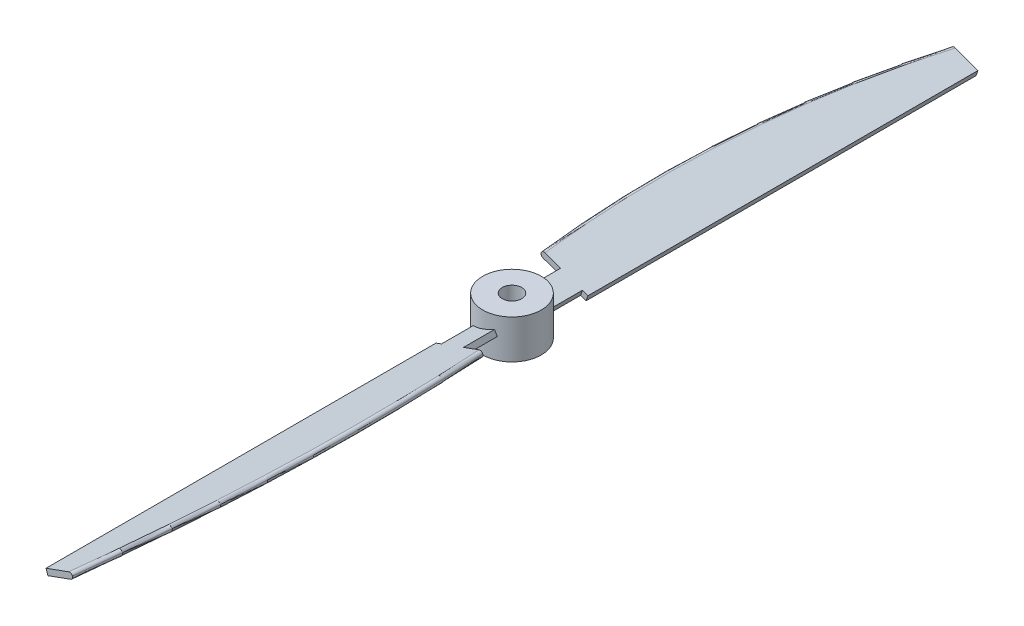
ISO-10303-21;
HEADER;
FILE_DESCRIPTION(('STEP AP214'),'2;1');
FILE_NAME('part.step','',(''),(''),'','','');
FILE_SCHEMA(('AUTOMOTIVE_DESIGN { 1 0 10303 214 1 1 1 1 }'));
ENDSEC;
DATA;
#1=APPLICATION_CONTEXT('core data for automotive mechanical design processes');
#2=APPLICATION_PROTOCOL_DEFINITION('international standard','automotive_design',2000,#1);
#3=PRODUCT_CONTEXT('',#1,'mechanical');
#4=PRODUCT('Part','Part','',(#3));
#5=PRODUCT_RELATED_PRODUCT_CATEGORY('part','',(#4));
#6=PRODUCT_DEFINITION_FORMATION('','',#4);
#7=PRODUCT_DEFINITION_CONTEXT('part definition',#1,'design');
#8=PRODUCT_DEFINITION('design','',#6,#7);
#9=PRODUCT_DEFINITION_SHAPE('','',#8);
#10=(LENGTH_UNIT() NAMED_UNIT(*) SI_UNIT(.MILLI.,.METRE.));
#11=(NAMED_UNIT(*) PLANE_ANGLE_UNIT() SI_UNIT($,.RADIAN.));
#12=(NAMED_UNIT(*) SI_UNIT($,.STERADIAN.) SOLID_ANGLE_UNIT());
#13=UNCERTAINTY_MEASURE_WITH_UNIT(LENGTH_MEASURE(1.E-05),#10,'distance_accuracy_value','');
#14=(GEOMETRIC_REPRESENTATION_CONTEXT(3) GLOBAL_UNCERTAINTY_ASSIGNED_CONTEXT((#13)) GLOBAL_UNIT_ASSIGNED_CONTEXT((#10,
#11,#12)) REPRESENTATION_CONTEXT('',''));
#15=CARTESIAN_POINT('',(0.,0.,0.));
#16=DIRECTION('',(0.,0.,1.));
#17=DIRECTION('',(1.,0.,0.));
#18=AXIS2_PLACEMENT_3D('',#15,#16,#17);
#19=CARTESIAN_POINT('',(0.,10.,0.));
#20=DIRECTION('',(0.,1.,0.));
#21=DIRECTION('',(0.,0.,1.));
#22=AXIS2_PLACEMENT_3D('',#19,#20,#21);
#23=PLANE('',#22);
#24=CARTESIAN_POINT('',(0.,10.,0.));
#25=DIRECTION('',(0.,1.,0.));
#26=DIRECTION('',(0.,0.,1.));
#27=AXIS2_PLACEMENT_3D('',#24,#25,#26);
#28=CIRCLE('',#27,15.);
#29=CARTESIAN_POINT('',(0.,10.,15.));
#30=VERTEX_POINT('',#29);
#31=EDGE_CURVE('E263',#30,#30,#28,.T.);
#32=ORIENTED_EDGE('',*,*,#31,.T.);
#33=EDGE_LOOP('',(#32));
#34=FACE_BOUND('',#33,.T.);
#35=CARTESIAN_POINT('',(0.,10.,0.));
#36=DIRECTION('',(0.,1.,0.));
#37=DIRECTION('',(0.,0.,1.));
#38=AXIS2_PLACEMENT_3D('',#35,#36,#37);
#39=CIRCLE('',#38,5.);
#40=CARTESIAN_POINT('',(0.,10.,5.));
#41=VERTEX_POINT('',#40);
#42=EDGE_CURVE('E257',#41,#41,#39,.T.);
#43=ORIENTED_EDGE('',*,*,#42,.F.);
#44=EDGE_LOOP('',(#43));
#45=FACE_BOUND('',#44,.T.);
#46=ADVANCED_FACE('F39',(#34,#45),#23,.T.);
#47=CARTESIAN_POINT('',(0.,-10.,0.));
#48=DIRECTION('',(0.,1.,0.));
#49=DIRECTION('',(0.,0.,1.));
#50=AXIS2_PLACEMENT_3D('',#47,#48,#49);
#51=PLANE('',#50);
#52=CARTESIAN_POINT('',(0.,-10.,0.));
#53=DIRECTION('',(0.,1.,0.));
#54=DIRECTION('',(0.,0.,1.));
#55=AXIS2_PLACEMENT_3D('',#52,#53,#54);
#56=CIRCLE('',#55,15.);
#57=CARTESIAN_POINT('',(0.,-10.,15.));
#58=VERTEX_POINT('',#57);
#59=EDGE_CURVE('E260',#58,#58,#56,.T.);
#60=ORIENTED_EDGE('',*,*,#59,.F.);
#61=EDGE_LOOP('',(#60));
#62=FACE_BOUND('',#61,.T.);
#63=CARTESIAN_POINT('',(0.,-10.,0.));
#64=DIRECTION('',(0.,1.,0.));
#65=DIRECTION('',(0.,0.,1.));
#66=AXIS2_PLACEMENT_3D('',#63,#64,#65);
#67=CIRCLE('',#66,5.);
#68=CARTESIAN_POINT('',(0.,-10.,5.));
#69=VERTEX_POINT('',#68);
#70=EDGE_CURVE('E256',#69,#69,#67,.T.);
#71=ORIENTED_EDGE('',*,*,#70,.T.);
#72=EDGE_LOOP('',(#71));
#73=FACE_BOUND('',#72,.T.);
#74=ADVANCED_FACE('F338',(#62,#73),#51,.F.);
#75=CARTESIAN_POINT('',(0.,10.,0.));
#76=DIRECTION('',(0.,-1.,0.));
#77=DIRECTION('',(0.,0.,-1.));
#78=AXIS2_PLACEMENT_3D('',#75,#76,#77);
#79=CYLINDRICAL_SURFACE('',#78,15.);
#80=CARTESIAN_POINT('',(0.,-17.5428264009787,0.));
#81=DIRECTION('',(0.939692620785909,0.342020143325666,0.));
#82=DIRECTION('',(0.342020143325666,-0.93969262078591,0.));
#83=AXIS2_PLACEMENT_3D('',#80,#81,#82);
#84=ELLIPSE('',#83,43.8570660024467,15.);
#85=CARTESIAN_POINT('',(-6.15118593970396,-0.64258192877513,13.6807496700725));
#86=VERTEX_POINT('',#85);
#87=CARTESIAN_POINT('',(-5.12512550972696,-3.46165979113286,14.0972723783555));
#88=VERTEX_POINT('',#87);
#89=EDGE_CURVE('E391',#86,#88,#84,.T.);
#90=ORIENTED_EDGE('',*,*,#89,.F.);
#91=CARTESIAN_POINT('',(0.,1.59626665871387,0.));
#92=DIRECTION('',(-0.342020143325666,0.93969262078591,0.));
#93=DIRECTION('',(-0.93969262078591,-0.342020143325666,0.));
#94=AXIS2_PLACEMENT_3D('',#91,#92,#93);
#95=ELLIPSE('',#94,15.9626665871387,15.);
#96=CARTESIAN_POINT('',(5.12512550972696,3.46165979113286,14.0972723783555));
#97=VERTEX_POINT('',#96);
#98=EDGE_CURVE('E170',#86,#97,#95,.T.);
#99=ORIENTED_EDGE('',*,*,#98,.T.);
#100=CARTESIAN_POINT('',(0.,17.5428264009787,0.));
#101=DIRECTION('',(-0.939692620785909,-0.342020143325666,0.));
#102=DIRECTION('',(0.342020143325666,-0.93969262078591,0.));
#103=AXIS2_PLACEMENT_3D('',#100,#101,#102);
#104=ELLIPSE('',#103,43.8570660024467,15.);
#105=CARTESIAN_POINT('',(6.15118593970396,0.64258192877513,13.6807496700725));
#106=VERTEX_POINT('',#105);
#107=EDGE_CURVE('E386',#106,#97,#104,.T.);
#108=ORIENTED_EDGE('',*,*,#107,.F.);
#109=CARTESIAN_POINT('',(0.,-1.59626665871387,0.));
#110=DIRECTION('',(-0.342020143325666,0.93969262078591,0.));
#111=DIRECTION('',(-0.93969262078591,-0.342020143325666,0.));
#112=AXIS2_PLACEMENT_3D('',#109,#110,#111);
#113=ELLIPSE('',#112,15.9626665871387,15.);
#114=EDGE_CURVE('E384',#88,#106,#113,.T.);
#115=ORIENTED_EDGE('',*,*,#114,.F.);
#116=EDGE_LOOP('',(#90,#99,#108,#115));
#117=FACE_BOUND('',#116,.T.);
#118=CARTESIAN_POINT('',(0.,-17.5428264009787,0.));
#119=DIRECTION('',(-0.939692620785909,0.342020143325666,0.));
#120=DIRECTION('',(-0.342020143325666,-0.93969262078591,0.));
#121=AXIS2_PLACEMENT_3D('',#118,#119,#120);
#122=ELLIPSE('',#121,43.8570660024467,15.);
#123=CARTESIAN_POINT('',(6.15118593970396,-0.64258192877513,-13.6807496700725));
#124=VERTEX_POINT('',#123);
#125=CARTESIAN_POINT('',(5.12512550972696,-3.46165979113286,-14.0972723783555));
#126=VERTEX_POINT('',#125);
#127=EDGE_CURVE('E274',#124,#126,#122,.T.);
#128=ORIENTED_EDGE('',*,*,#127,.F.);
#129=CARTESIAN_POINT('',(0.,1.59626665871387,0.));
#130=DIRECTION('',(0.342020143325666,0.93969262078591,0.));
#131=DIRECTION('',(0.93969262078591,-0.342020143325666,0.));
#132=AXIS2_PLACEMENT_3D('',#129,#130,#131);
#133=ELLIPSE('',#132,15.9626665871387,15.);
#134=CARTESIAN_POINT('',(-5.12512550972696,3.46165979113286,-14.0972723783555));
#135=VERTEX_POINT('',#134);
#136=EDGE_CURVE('E277',#124,#135,#133,.T.);
#137=ORIENTED_EDGE('',*,*,#136,.T.);
#138=CARTESIAN_POINT('',(0.,17.5428264009787,0.));
#139=DIRECTION('',(0.939692620785909,-0.342020143325666,0.));
#140=DIRECTION('',(-0.342020143325666,-0.93969262078591,0.));
#141=AXIS2_PLACEMENT_3D('',#138,#139,#140);
#142=ELLIPSE('',#141,43.8570660024467,15.);
#143=CARTESIAN_POINT('',(-6.15118593970396,0.64258192877513,-13.6807496700725));
#144=VERTEX_POINT('',#143);
#145=EDGE_CURVE('E271',#144,#135,#142,.T.);
#146=ORIENTED_EDGE('',*,*,#145,.F.);
#147=CARTESIAN_POINT('',(0.,-1.59626665871387,0.));
#148=DIRECTION('',(0.342020143325666,0.93969262078591,0.));
#149=DIRECTION('',(0.93969262078591,-0.342020143325666,0.));
#150=AXIS2_PLACEMENT_3D('',#147,#148,#149);
#151=ELLIPSE('',#150,15.9626665871387,15.);
#152=EDGE_CURVE('E266',#126,#144,#151,.T.);
#153=ORIENTED_EDGE('',*,*,#152,.F.);
#154=EDGE_LOOP('',(#128,#137,#146,#153));
#155=FACE_BOUND('',#154,.T.);
#156=ORIENTED_EDGE('',*,*,#31,.F.);
#157=EDGE_LOOP('',(#156));
#158=FACE_BOUND('',#157,.T.);
#159=ORIENTED_EDGE('',*,*,#59,.T.);
#160=EDGE_LOOP('',(#159));
#161=FACE_BOUND('',#160,.T.);
#162=ADVANCED_FACE('F333',(#117,#155,#158,#161),#79,.T.);
#163=CARTESIAN_POINT('',(0.,10.,0.));
#164=DIRECTION('',(0.,-1.,0.));
#165=DIRECTION('',(0.,0.,-1.));
#166=AXIS2_PLACEMENT_3D('',#163,#164,#165);
#167=CYLINDRICAL_SURFACE('',#166,5.);
#168=ORIENTED_EDGE('',*,*,#42,.T.);
#169=EDGE_LOOP('',(#168));
#170=FACE_BOUND('',#169,.T.);
#171=ORIENTED_EDGE('',*,*,#70,.F.);
#172=EDGE_LOOP('',(#171));
#173=FACE_BOUND('',#172,.T.);
#174=ADVANCED_FACE('F337',(#170,#173),#167,.F.);
#175=CARTESIAN_POINT('',(6.15118593970396,-0.642581928775131,-30.));
#176=DIRECTION('',(-0.939692620785909,0.342020143325666,0.));
#177=DIRECTION('',(-0.342020143325666,-0.93969262078591,0.));
#178=AXIS2_PLACEMENT_3D('',#175,#176,#177);
#179=PLANE('',#178);
#180=DIRECTION('',(0.,0.,-1.));
#181=VECTOR('',#180,1.);
#182=CARTESIAN_POINT('',(6.15118593970396,-0.642581928775131,-30.));
#183=LINE('',#182,#181);
#184=CARTESIAN_POINT('',(6.15118593970396,-0.642581928775131,-30.));
#185=VERTEX_POINT('',#184);
#186=EDGE_CURVE('E216',#124,#185,#183,.T.);
#187=ORIENTED_EDGE('',*,*,#186,.F.);
#188=ORIENTED_EDGE('',*,*,#127,.T.);
#189=DIRECTION('',(0.,0.,-1.));
#190=VECTOR('',#189,1.);
#191=CARTESIAN_POINT('',(5.12512550972696,-3.46165979113286,-30.));
#192=LINE('',#191,#190);
#193=CARTESIAN_POINT('',(5.12512550972696,-3.46165979113286,-30.));
#194=VERTEX_POINT('',#193);
#195=EDGE_CURVE('E232',#126,#194,#192,.T.);
#196=ORIENTED_EDGE('',*,*,#195,.T.);
#197=DIRECTION('',(-0.342020143325666,-0.939692620785909,0.));
#198=VECTOR('',#197,1.);
#199=CARTESIAN_POINT('',(6.15118593970396,-0.642581928775131,-30.));
#200=LINE('',#199,#198);
#201=EDGE_CURVE('E253',#185,#194,#200,.T.);
#202=ORIENTED_EDGE('',*,*,#201,.F.);
#203=EDGE_LOOP('',(#187,#188,#196,#202));
#204=FACE_BOUND('',#203,.T.);
#205=ADVANCED_FACE('F348',(#204),#179,.F.);
#206=CARTESIAN_POINT('',(8.97026380206169,-1.66864235875213,-30.));
#207=DIRECTION('',(0.,0.,-1.));
#208=DIRECTION('',(-1.,0.,0.));
#209=AXIS2_PLACEMENT_3D('',#206,#207,#208);
#210=PLANE('',#209);
#211=DIRECTION('',(0.939692620785909,-0.342020143325666,0.));
#212=VECTOR('',#211,1.);
#213=CARTESIAN_POINT('',(7.94420337208469,-4.48772022110986,-30.));
#214=LINE('',#213,#212);
#215=CARTESIAN_POINT('',(7.94420337208469,-4.48772022110986,-30.));
#216=VERTEX_POINT('',#215);
#217=EDGE_CURVE('E234',#194,#216,#214,.T.);
#218=ORIENTED_EDGE('',*,*,#217,.T.);
#219=DIRECTION('',(-0.342020143325666,-0.939692620785909,0.));
#220=VECTOR('',#219,1.);
#221=CARTESIAN_POINT('',(8.97026380206169,-1.66864235875213,-30.));
#222=LINE('',#221,#220);
#223=CARTESIAN_POINT('',(8.97026380206169,-1.66864235875213,-30.));
#224=VERTEX_POINT('',#223);
#225=EDGE_CURVE('E250',#224,#216,#222,.T.);
#226=ORIENTED_EDGE('',*,*,#225,.F.);
#227=DIRECTION('',(0.939692620785909,-0.342020143325666,0.));
#228=VECTOR('',#227,1.);
#229=CARTESIAN_POINT('',(8.97026380206169,-1.66864235875213,-30.));
#230=LINE('',#229,#228);
#231=EDGE_CURVE('E218',#185,#224,#230,.T.);
#232=ORIENTED_EDGE('',*,*,#231,.F.);
#233=ORIENTED_EDGE('',*,*,#201,.T.);
#234=EDGE_LOOP('',(#218,#226,#232,#233));
#235=FACE_BOUND('',#234,.T.);
#236=ADVANCED_FACE('F351',(#235),#210,.F.);
#237=CARTESIAN_POINT('',(8.97026380206169,-1.66864235875213,-230.));
#238=DIRECTION('',(-0.939692620785909,0.342020143325666,0.));
#239=DIRECTION('',(-0.342020143325666,-0.93969262078591,0.));
#240=AXIS2_PLACEMENT_3D('',#237,#238,#239);
#241=PLANE('',#240);
#242=DIRECTION('',(0.,0.,-1.));
#243=VECTOR('',#242,1.);
#244=CARTESIAN_POINT('',(7.94420337208469,-4.48772022110986,-230.));
#245=LINE('',#244,#243);
#246=CARTESIAN_POINT('',(7.94420337208469,-4.48772022110986,-230.));
#247=VERTEX_POINT('',#246);
#248=EDGE_CURVE('E236',#216,#247,#245,.T.);
#249=ORIENTED_EDGE('',*,*,#248,.T.);
#250=DIRECTION('',(-0.342020143325666,-0.939692620785909,0.));
#251=VECTOR('',#250,1.);
#252=CARTESIAN_POINT('',(8.97026380206169,-1.66864235875213,-230.));
#253=LINE('',#252,#251);
#254=CARTESIAN_POINT('',(8.97026380206169,-1.66864235875213,-230.));
#255=VERTEX_POINT('',#254);
#256=EDGE_CURVE('E247',#255,#247,#253,.T.);
#257=ORIENTED_EDGE('',*,*,#256,.F.);
#258=DIRECTION('',(0.,0.,-1.));
#259=VECTOR('',#258,1.);
#260=CARTESIAN_POINT('',(8.97026380206169,-1.66864235875213,-230.));
#261=LINE('',#260,#259);
#262=EDGE_CURVE('E221',#224,#255,#261,.T.);
#263=ORIENTED_EDGE('',*,*,#262,.F.);
#264=ORIENTED_EDGE('',*,*,#225,.T.);
#265=EDGE_LOOP('',(#249,#257,#263,#264));
#266=FACE_BOUND('',#265,.T.);
#267=ADVANCED_FACE('F309',(#266),#241,.F.);
#268=CARTESIAN_POINT('',(-4.10376479091385,3.08991489103616,-230.));
#269=DIRECTION('',(0.,0.,1.));
#270=DIRECTION('',(1.,0.,0.));
#271=AXIS2_PLACEMENT_3D('',#268,#269,#270);
#272=PLANE('',#271);
#273=DIRECTION('',(-0.93969262078591,0.342020143325666,0.));
#274=VECTOR('',#273,1.);
#275=CARTESIAN_POINT('',(-5.12982522089084,0.270837028678429,-230.));
#276=LINE('',#275,#274);
#277=CARTESIAN_POINT('',(-3.68994377770359,-0.253236957513988,-230.));
#278=VERTEX_POINT('',#277);
#279=EDGE_CURVE('E238',#247,#278,#276,.T.);
#280=ORIENTED_EDGE('',*,*,#279,.T.);
#281=CARTESIAN_POINT('',(-3.68994377770359,-0.253236957513988,-230.));
#282=CARTESIAN_POINT('',(-3.73109994846644,-0.238256498056074,-230.));
#283=CARTESIAN_POINT('',(-3.77160811484241,-0.221556352935874,-230.));
#284=CARTESIAN_POINT('',(-3.85108277624128,-0.184821468177457,-230.));
#285=CARTESIAN_POINT('',(-3.89004927854202,-0.16478674428332,-230.));
#286=CARTESIAN_POINT('',(-4.004190066889,-0.0998821593906964,-230.));
#287=CARTESIAN_POINT('',(-4.07669128880496,-0.0501806364316625,-230.));
#288=CARTESIAN_POINT('',(-4.21231656205706,0.0607247267269148,-230.));
#289=CARTESIAN_POINT('',(-4.27543406513151,0.121936532335215,-230.));
#290=CARTESIAN_POINT('',(-4.3903633806611,0.254172271316739,-230.));
#291=CARTESIAN_POINT('',(-4.44217918579952,0.325192724945103,-230.));
#292=CARTESIAN_POINT('',(-4.5324211872921,0.474311590887981,-230.));
#293=CARTESIAN_POINT('',(-4.57097650048926,0.552331844672881,-230.));
#294=CARTESIAN_POINT('',(-4.63414326955771,0.713855685224666,-230.));
#295=CARTESIAN_POINT('',(-4.65875267794604,0.797360075143683,-230.));
#296=CARTESIAN_POINT('',(-4.69278359541074,0.965651335726991,-230.));
#297=CARTESIAN_POINT('',(-4.70250060007262,1.05037863921779,-230.));
#298=CARTESIAN_POINT('',(-4.70726170541918,1.22021369288134,-230.));
#299=CARTESIAN_POINT('',(-4.70231895780466,1.30532103369647,-230.));
#300=CARTESIAN_POINT('',(-4.68288465028204,1.43894538235573,-230.));
#301=CARTESIAN_POINT('',(-4.67312322178342,1.48819624350865,-230.));
#302=CARTESIAN_POINT('',(-4.64864357028431,1.58537426826552,-230.));
#303=CARTESIAN_POINT('',(-4.63393254287304,1.63330324477032,-230.));
#304=CARTESIAN_POINT('',(-4.61679500590245,1.68037595985728,-230.));
#305=B_SPLINE_CURVE_WITH_KNOTS('',3,(#281,#282,#283,#284,#285,#286,#287,#288,#289,#290,#291,
#292,#293,#294,#295,#296,#297,#298,#299,#300,#301,#302,#303,#304),.UNSPECIFIED.,.F.,.F.,(4,2,2,
2,2,2,2,2,2,2,2,4),(0.,0.131313362133667,0.262626104294087,0.52498150824543,0.787519141475853,
1.04996387418957,1.30977561081868,1.56962548211074,1.82424941976357,2.07864499580723,
2.22903322232975,2.37920375656986),.UNSPECIFIED.);
#306=CARTESIAN_POINT('',(-4.61679500590235,1.68037595985727,-230.));
#307=VERTEX_POINT('',#306);
#308=EDGE_CURVE('E320',#278,#307,#305,.T.);
#309=ORIENTED_EDGE('',*,*,#308,.T.);
#310=CARTESIAN_POINT('',(-4.61679500590235,1.68037595985727,-230.));
#311=CARTESIAN_POINT('',(-4.60258144942086,1.71942793699769,-230.));
#312=CARTESIAN_POINT('',(-4.58671556749747,1.75785708620029,-230.));
#313=CARTESIAN_POINT('',(-4.55178964846196,1.83323119198095,-230.));
#314=CARTESIAN_POINT('',(-4.53272989913771,1.87017628191072,-230.));
#315=CARTESIAN_POINT('',(-4.47101318902057,1.97827712091045,-230.));
#316=CARTESIAN_POINT('',(-4.4237543498409,2.04687474616012,-230.));
#317=CARTESIAN_POINT('',(-4.31842087407881,2.17515677648972,-230.));
#318=CARTESIAN_POINT('',(-4.26034326801245,2.23483872631357,-230.));
#319=CARTESIAN_POINT('',(-4.13507162705023,2.3437170782315,-230.));
#320=CARTESIAN_POINT('',(-4.0678776745321,2.39291357506459,-230.));
#321=CARTESIAN_POINT('',(-3.92566482813508,2.47995676843831,-230.));
#322=CARTESIAN_POINT('',(-3.85058018424097,2.51769590862367,-230.));
#323=CARTESIAN_POINT('',(-3.6952171126939,2.58031650138632,-230.));
#324=CARTESIAN_POINT('',(-3.61493750815402,2.60519502891459,-230.));
#325=CARTESIAN_POINT('',(-3.44976637382885,2.64191225687513,-230.));
#326=CARTESIAN_POINT('',(-3.36481465663441,2.65347959913137,-230.));
#327=CARTESIAN_POINT('',(-3.19417610318607,2.66246581380547,-230.));
#328=CARTESIAN_POINT('',(-3.10848948707065,2.65988878487239,-230.));
#329=CARTESIAN_POINT('',(-2.96222910640332,2.6434189578466,-230.));
#330=CARTESIAN_POINT('',(-2.90125944189797,2.63285019749014,-230.));
#331=CARTESIAN_POINT('',(-2.78107802525582,2.60461311505573,-230.));
#332=CARTESIAN_POINT('',(-2.72186390826066,2.58695485771326,-230.));
#333=CARTESIAN_POINT('',(-2.6638833477266,2.56584090484377,-230.));
#334=B_SPLINE_CURVE_WITH_KNOTS('',3,(#310,#311,#312,#313,#314,#315,#316,#317,#318,#319,#320,
#321,#322,#323,#324,#325,#326,#327,#328,#329,#330,#331,#332,#333),.UNSPECIFIED.,.F.,.F.,(4,2,2,
2,2,2,2,2,2,2,2,4),(0.,0.124597170050856,0.249183119131198,0.497799138520036,0.746483497673533,
0.995165609798993,1.24611477456639,1.49712099073733,1.75315824383104,2.00912130830096,
2.19434658955877,2.37930983693773),.UNSPECIFIED.);
#335=CARTESIAN_POINT('',(-2.6638833477266,2.56584090484374,-230.));
#336=VERTEX_POINT('',#335);
#337=EDGE_CURVE('E314',#307,#336,#334,.T.);
#338=ORIENTED_EDGE('',*,*,#337,.T.);
#339=DIRECTION('',(-0.93969262078591,0.342020143325666,0.));
#340=VECTOR('',#339,1.);
#341=CARTESIAN_POINT('',(-4.10376479091385,3.08991489103616,-230.));
#342=LINE('',#341,#340);
#343=EDGE_CURVE('E223',#255,#336,#342,.T.);
#344=ORIENTED_EDGE('',*,*,#343,.F.);
#345=ORIENTED_EDGE('',*,*,#256,.T.);
#346=EDGE_LOOP('',(#280,#309,#338,#344,#345));
#347=FACE_BOUND('',#346,.T.);
#348=ADVANCED_FACE('F302',(#347),#272,.F.);
#349=CARTESIAN_POINT('',(-5.12512550972696,3.46165979113286,-30.));
#350=DIRECTION('',(0.,0.,-1.));
#351=DIRECTION('',(-1.,0.,0.));
#352=AXIS2_PLACEMENT_3D('',#349,#350,#351);
#353=PLANE('',#352);
#354=CARTESIAN_POINT('',(-13.1061587093581,6.3665183144889,-30.));
#355=CARTESIAN_POINT('',(-13.1461258460584,6.38106475356222,-30.));
#356=CARTESIAN_POINT('',(-13.1866871515792,6.39391929416949,-30.));
#357=CARTESIAN_POINT('',(-13.2687454552845,6.41617126797397,-30.));
#358=CARTESIAN_POINT('',(-13.3102424170261,6.4255688355711,-30.));
#359=CARTESIAN_POINT('',(-13.4356353058268,6.4484444039163,-30.));
#360=CARTESIAN_POINT('',(-13.5205563529978,6.45664994925798,-30.));
#361=CARTESIAN_POINT('',(-13.6905728769424,6.458682295635,-30.));
#362=CARTESIAN_POINT('',(-13.775668421893,6.45250154425818,-30.));
#363=CARTESIAN_POINT('',(-13.9436019699442,6.42591422311782,-30.));
#364=CARTESIAN_POINT('',(-14.0264404494921,6.40551068022055,-30.));
#365=CARTESIAN_POINT('',(-14.1873257723744,6.35108643346621,-30.));
#366=CARTESIAN_POINT('',(-14.2653820411621,6.31709357893554,-30.));
#367=CARTESIAN_POINT('',(-14.4146629225278,6.23642203794727,-30.));
#368=CARTESIAN_POINT('',(-14.4858862560095,6.18974098255736,-30.));
#369=CARTESIAN_POINT('',(-14.6191438606422,6.085232651057,-30.));
#370=CARTESIAN_POINT('',(-14.6812142484666,6.02745137545105,-30.));
#371=CARTESIAN_POINT('',(-14.7946989580344,5.90225949010442,-30.));
#372=CARTESIAN_POINT('',(-14.8461201901485,5.83485517316001,-30.));
#373=CARTESIAN_POINT('',(-14.9206230996501,5.71784912756266,-30.));
#374=CARTESIAN_POINT('',(-14.9472700426289,5.67047658445683,-30.));
#375=CARTESIAN_POINT('',(-14.9952266812771,5.57318706717563,-30.));
#376=CARTESIAN_POINT('',(-15.0165439274312,5.52327381450985,-30.));
#377=CARTESIAN_POINT('',(-15.0350819325747,5.47232229321071,-30.));
#378=B_SPLINE_CURVE_WITH_KNOTS('',3,(#354,#355,#356,#357,#358,#359,#360,#361,#362,#363,#364,
#365,#366,#367,#368,#369,#370,#371,#372,#373,#374,#375,#376,#377),.UNSPECIFIED.,.F.,.F.,(4,2,2,
2,2,2,2,2,2,2,2,4),(0.,0.127517788653502,0.255030619156772,0.509668352387299,0.764439793608594,
1.01915703142414,1.27335491739387,1.52760029565351,1.78081393675103,2.03386274589243,
2.19662241278115,2.35915017755046),.UNSPECIFIED.);
#379=CARTESIAN_POINT('',(-13.1061587093581,6.3665183144889,-30.));
#380=VERTEX_POINT('',#379);
#381=CARTESIAN_POINT('',(-15.0350819325747,5.47232229321066,-30.));
#382=VERTEX_POINT('',#381);
#383=EDGE_CURVE('E279',#380,#382,#378,.T.);
#384=ORIENTED_EDGE('',*,*,#383,.T.);
#385=CARTESIAN_POINT('',(-15.0350819325747,5.47232229321066,-30.));
#386=CARTESIAN_POINT('',(-15.0494687486839,5.43279431391577,-30.));
#387=CARTESIAN_POINT('',(-15.0621777290701,5.39267714868165,-30.));
#388=CARTESIAN_POINT('',(-15.084168574262,5.31151674519578,-30.));
#389=CARTESIAN_POINT('',(-15.0934506339949,5.27047355975811,-30.));
#390=CARTESIAN_POINT('',(-15.1160247139244,5.1464733902153,-30.));
#391=CARTESIAN_POINT('',(-15.1240961754175,5.06250372425615,-30.));
#392=CARTESIAN_POINT('',(-15.1260317061262,4.89440809925761,-30.));
#393=CARTESIAN_POINT('',(-15.1198895701641,4.81028208798291,-30.));
#394=CARTESIAN_POINT('',(-15.0936001852183,4.64425022899424,-30.));
#395=CARTESIAN_POINT('',(-15.0734549004741,4.56234407157254,-30.));
#396=CARTESIAN_POINT('',(-15.0197020320048,4.40290034959478,-30.));
#397=CARTESIAN_POINT('',(-14.9860680779903,4.32537168370937,-30.));
#398=CARTESIAN_POINT('',(-14.9063071736053,4.17701124377367,-30.));
#399=CARTESIAN_POINT('',(-14.8601776807238,4.10618083660292,-30.));
#400=CARTESIAN_POINT('',(-14.7565282855368,3.97291666629323,-30.));
#401=CARTESIAN_POINT('',(-14.6989589243882,3.91052141195352,-30.));
#402=CARTESIAN_POINT('',(-14.5742051239199,3.79625517514949,-30.));
#403=CARTESIAN_POINT('',(-14.5070257284706,3.74437870616585,-30.));
#404=CARTESIAN_POINT('',(-14.3883961508586,3.66770486474183,-30.));
#405=CARTESIAN_POINT('',(-14.3390401012958,3.6396130059871,-30.));
#406=CARTESIAN_POINT('',(-14.2375651407231,3.58916802598874,-30.));
#407=CARTESIAN_POINT('',(-14.185450245224,3.56680682656266,-30.));
#408=CARTESIAN_POINT('',(-14.1322191393351,3.54744045213115,-30.));
#409=B_SPLINE_CURVE_WITH_KNOTS('',3,(#385,#386,#387,#388,#389,#390,#391,#392,#393,#394,#395,
#396,#397,#398,#399,#400,#401,#402,#403,#404,#405,#406,#407,#408),.UNSPECIFIED.,.F.,.F.,(4,2,2,
2,2,2,2,2,2,2,2,4),(0.,0.12611651853833,0.252225862312548,0.503996946310296,0.755877965813269,
1.007723660773,1.26006413198616,1.51245598641566,1.76596374463488,2.01933893303225,
2.18937612306642,2.35917228637031),.UNSPECIFIED.);
#410=CARTESIAN_POINT('',(-14.1322191393351,3.54744045213117,-30.));
#411=VERTEX_POINT('',#410);
#412=EDGE_CURVE('E287',#382,#411,#409,.T.);
#413=ORIENTED_EDGE('',*,*,#412,.T.);
#414=DIRECTION('',(0.939692620785909,-0.342020143325666,0.));
#415=VECTOR('',#414,1.);
#416=CARTESIAN_POINT('',(-6.15118593970396,0.642581928775131,-30.));
#417=LINE('',#416,#415);
#418=CARTESIAN_POINT('',(-6.15118593970396,0.642581928775131,-30.));
#419=VERTEX_POINT('',#418);
#420=EDGE_CURVE('E241',#411,#419,#417,.T.);
#421=ORIENTED_EDGE('',*,*,#420,.T.);
#422=DIRECTION('',(-0.342020143325666,-0.939692620785909,0.));
#423=VECTOR('',#422,1.);
#424=CARTESIAN_POINT('',(-5.12512550972696,3.46165979113286,-30.));
#425=LINE('',#424,#423);
#426=CARTESIAN_POINT('',(-5.12512550972696,3.46165979113286,-30.));
#427=VERTEX_POINT('',#426);
#428=EDGE_CURVE('E231',#427,#419,#425,.T.);
#429=ORIENTED_EDGE('',*,*,#428,.F.);
#430=DIRECTION('',(0.939692620785909,-0.342020143325666,0.));
#431=VECTOR('',#430,1.);
#432=CARTESIAN_POINT('',(-5.12512550972696,3.46165979113286,-30.));
#433=LINE('',#432,#431);
#434=EDGE_CURVE('E226',#380,#427,#433,.T.);
#435=ORIENTED_EDGE('',*,*,#434,.F.);
#436=EDGE_LOOP('',(#384,#413,#421,#429,#435));
#437=FACE_BOUND('',#436,.T.);
#438=ADVANCED_FACE('F296',(#437),#353,.F.);
#439=CARTESIAN_POINT('',(-5.12512550972696,3.46165979113286,-13.));
#440=DIRECTION('',(0.939692620785909,-0.342020143325666,0.));
#441=DIRECTION('',(0.342020143325666,0.93969262078591,0.));
#442=AXIS2_PLACEMENT_3D('',#439,#440,#441);
#443=PLANE('',#442);
#444=DIRECTION('',(0.,0.,1.));
#445=VECTOR('',#444,1.);
#446=CARTESIAN_POINT('',(-6.15118593970396,0.64258192877513,-13.));
#447=LINE('',#446,#445);
#448=EDGE_CURVE('E219',#419,#144,#447,.T.);
#449=ORIENTED_EDGE('',*,*,#448,.T.);
#450=ORIENTED_EDGE('',*,*,#145,.T.);
#451=DIRECTION('',(0.,0.,1.));
#452=VECTOR('',#451,1.);
#453=CARTESIAN_POINT('',(-5.12512550972696,3.46165979113286,-13.));
#454=LINE('',#453,#452);
#455=EDGE_CURVE('E228',#427,#135,#454,.T.);
#456=ORIENTED_EDGE('',*,*,#455,.F.);
#457=ORIENTED_EDGE('',*,*,#428,.T.);
#458=EDGE_LOOP('',(#449,#450,#456,#457));
#459=FACE_BOUND('',#458,.T.);
#460=ADVANCED_FACE('F301',(#459),#443,.F.);
#461=CARTESIAN_POINT('',(0.513030214988499,1.40953893117886,2.90597372058687));
#462=DIRECTION('',(0.342020143325666,0.93969262078591,0.));
#463=DIRECTION('',(-0.93969262078591,0.342020143325666,0.));
#464=AXIS2_PLACEMENT_3D('',#461,#462,#463);
#465=PLANE('',#464);
#466=ORIENTED_EDGE('',*,*,#343,.T.);
#467=CARTESIAN_POINT('',(612.252926346616,-221.24557437383,-93.3324561342761));
#468=DIRECTION('',(0.342020143325666,0.93969262078591,0.));
#469=DIRECTION('',(-0.93969262078591,0.342020143325666,0.));
#470=AXIS2_PLACEMENT_3D('',#467,#468,#469);
#471=CIRCLE('',#470,668.5);
#472=EDGE_CURVE('E326',#336,#380,#471,.T.);
#473=ORIENTED_EDGE('',*,*,#472,.T.);
#474=ORIENTED_EDGE('',*,*,#434,.T.);
#475=ORIENTED_EDGE('',*,*,#455,.T.);
#476=ORIENTED_EDGE('',*,*,#136,.F.);
#477=ORIENTED_EDGE('',*,*,#186,.T.);
#478=ORIENTED_EDGE('',*,*,#231,.T.);
#479=ORIENTED_EDGE('',*,*,#262,.T.);
#480=EDGE_LOOP('',(#466,#473,#474,#475,#476,#477,#478,#479));
#481=FACE_BOUND('',#480,.T.);
#482=ADVANCED_FACE('F378',(#481),#465,.T.);
#483=CARTESIAN_POINT('',(-0.513030214988499,-1.40953893117886,2.90597372058687));
#484=DIRECTION('',(0.342020143325666,0.93969262078591,0.));
#485=DIRECTION('',(-0.93969262078591,0.342020143325666,0.));
#486=AXIS2_PLACEMENT_3D('',#483,#484,#485);
#487=PLANE('',#486);
#488=ORIENTED_EDGE('',*,*,#420,.F.);
#489=CARTESIAN_POINT('',(611.226865916639,-224.064652236187,-93.3324561342761));
#490=DIRECTION('',(0.342020143325666,0.93969262078591,0.));
#491=DIRECTION('',(-0.93969262078591,0.342020143325666,0.));
#492=AXIS2_PLACEMENT_3D('',#489,#490,#491);
#493=CIRCLE('',#492,668.5);
#494=EDGE_CURVE('E373',#411,#278,#493,.F.);
#495=ORIENTED_EDGE('',*,*,#494,.T.);
#496=ORIENTED_EDGE('',*,*,#279,.F.);
#497=ORIENTED_EDGE('',*,*,#248,.F.);
#498=ORIENTED_EDGE('',*,*,#217,.F.);
#499=ORIENTED_EDGE('',*,*,#195,.F.);
#500=ORIENTED_EDGE('',*,*,#152,.T.);
#501=ORIENTED_EDGE('',*,*,#448,.F.);
#502=EDGE_LOOP('',(#488,#495,#496,#497,#498,#499,#500,#501));
#503=FACE_BOUND('',#502,.T.);
#504=ADVANCED_FACE('F370',(#503),#487,.F.);
#505=CARTESIAN_POINT('',(611.739896131627,-222.655113305008,-93.3324561342761));
#506=DIRECTION('',(0.342020143325666,0.93969262078591,0.));
#507=DIRECTION('',(-0.93969262078591,0.342020143325666,0.));
#508=AXIS2_PLACEMENT_3D('',#505,#506,#507);
#509=TOROIDAL_SURFACE('',#508,668.5,1.5);
#510=ORIENTED_EDGE('',*,*,#472,.F.);
#511=ORIENTED_EDGE('',*,*,#337,.F.);
#512=CARTESIAN_POINT('',(611.739896131627,-222.655113305008,-93.3324561342761));
#513=DIRECTION('',(0.342020143325666,0.93969262078591,0.));
#514=DIRECTION('',(-0.93969262078591,0.342020143325666,0.));
#515=AXIS2_PLACEMENT_3D('',#512,#513,#514);
#516=CIRCLE('',#515,670.);
#517=EDGE_CURVE('E182',#382,#307,#516,.F.);
#518=ORIENTED_EDGE('',*,*,#517,.F.);
#519=ORIENTED_EDGE('',*,*,#383,.F.);
#520=EDGE_LOOP('',(#510,#511,#518,#519));
#521=FACE_BOUND('',#520,.T.);
#522=ADVANCED_FACE('F294',(#521),#509,.T.);
#523=CARTESIAN_POINT('',(611.739896131627,-222.655113305008,-93.3324561342761));
#524=DIRECTION('',(0.342020143325666,0.93969262078591,0.));
#525=DIRECTION('',(-0.93969262078591,0.342020143325666,0.));
#526=AXIS2_PLACEMENT_3D('',#523,#524,#525);
#527=TOROIDAL_SURFACE('',#526,668.5,1.5);
#528=ORIENTED_EDGE('',*,*,#308,.F.);
#529=ORIENTED_EDGE('',*,*,#494,.F.);
#530=ORIENTED_EDGE('',*,*,#412,.F.);
#531=ORIENTED_EDGE('',*,*,#517,.T.);
#532=EDGE_LOOP('',(#528,#529,#530,#531));
#533=FACE_BOUND('',#532,.T.);
#534=ADVANCED_FACE('F328',(#533),#527,.T.);
#535=CARTESIAN_POINT('',(-6.15118593970396,-0.642581928775131,30.));
#536=DIRECTION('',(0.939692620785909,0.342020143325666,0.));
#537=DIRECTION('',(-0.342020143325666,0.93969262078591,0.));
#538=AXIS2_PLACEMENT_3D('',#535,#536,#537);
#539=PLANE('',#538);
#540=DIRECTION('',(0.,0.,1.));
#541=VECTOR('',#540,1.);
#542=CARTESIAN_POINT('',(-6.15118593970396,-0.642581928775131,30.));
#543=LINE('',#542,#541);
#544=CARTESIAN_POINT('',(-6.15118593970396,-0.642581928775131,30.));
#545=VERTEX_POINT('',#544);
#546=EDGE_CURVE('E163',#86,#545,#543,.T.);
#547=ORIENTED_EDGE('',*,*,#546,.F.);
#548=ORIENTED_EDGE('',*,*,#89,.T.);
#549=DIRECTION('',(0.,0.,1.));
#550=VECTOR('',#549,1.);
#551=CARTESIAN_POINT('',(-5.12512550972696,-3.46165979113286,30.));
#552=LINE('',#551,#550);
#553=CARTESIAN_POINT('',(-5.12512550972696,-3.46165979113286,30.));
#554=VERTEX_POINT('',#553);
#555=EDGE_CURVE('E179',#88,#554,#552,.T.);
#556=ORIENTED_EDGE('',*,*,#555,.T.);
#557=DIRECTION('',(0.342020143325666,-0.939692620785909,0.));
#558=VECTOR('',#557,1.);
#559=CARTESIAN_POINT('',(-6.15118593970396,-0.642581928775131,30.));
#560=LINE('',#559,#558);
#561=EDGE_CURVE('E176',#545,#554,#560,.T.);
#562=ORIENTED_EDGE('',*,*,#561,.F.);
#563=EDGE_LOOP('',(#547,#548,#556,#562));
#564=FACE_BOUND('',#563,.T.);
#565=ADVANCED_FACE('F177',(#564),#539,.F.);
#566=CARTESIAN_POINT('',(-8.97026380206169,-1.66864235875213,30.));
#567=DIRECTION('',(0.,0.,1.));
#568=DIRECTION('',(1.,0.,0.));
#569=AXIS2_PLACEMENT_3D('',#566,#567,#568);
#570=PLANE('',#569);
#571=DIRECTION('',(-0.939692620785909,-0.342020143325666,0.));
#572=VECTOR('',#571,1.);
#573=CARTESIAN_POINT('',(-7.94420337208469,-4.48772022110986,30.));
#574=LINE('',#573,#572);
#575=CARTESIAN_POINT('',(-7.94420337208469,-4.48772022110986,30.));
#576=VERTEX_POINT('',#575);
#577=EDGE_CURVE('E200',#554,#576,#574,.T.);
#578=ORIENTED_EDGE('',*,*,#577,.T.);
#579=DIRECTION('',(0.342020143325666,-0.939692620785909,0.));
#580=VECTOR('',#579,1.);
#581=CARTESIAN_POINT('',(-8.97026380206169,-1.66864235875213,30.));
#582=LINE('',#581,#580);
#583=CARTESIAN_POINT('',(-8.97026380206169,-1.66864235875213,30.));
#584=VERTEX_POINT('',#583);
#585=EDGE_CURVE('E183',#584,#576,#582,.T.);
#586=ORIENTED_EDGE('',*,*,#585,.F.);
#587=DIRECTION('',(-0.939692620785909,-0.342020143325666,0.));
#588=VECTOR('',#587,1.);
#589=CARTESIAN_POINT('',(-8.97026380206169,-1.66864235875213,30.));
#590=LINE('',#589,#588);
#591=EDGE_CURVE('E167',#545,#584,#590,.T.);
#592=ORIENTED_EDGE('',*,*,#591,.F.);
#593=ORIENTED_EDGE('',*,*,#561,.T.);
#594=EDGE_LOOP('',(#578,#586,#592,#593));
#595=FACE_BOUND('',#594,.T.);
#596=ADVANCED_FACE('F185',(#595),#570,.F.);
#597=CARTESIAN_POINT('',(-8.97026380206169,-1.66864235875213,230.));
#598=DIRECTION('',(0.939692620785909,0.342020143325666,0.));
#599=DIRECTION('',(-0.342020143325666,0.93969262078591,0.));
#600=AXIS2_PLACEMENT_3D('',#597,#598,#599);
#601=PLANE('',#600);
#602=DIRECTION('',(0.,0.,1.));
#603=VECTOR('',#602,1.);
#604=CARTESIAN_POINT('',(-7.94420337208469,-4.48772022110986,230.));
#605=LINE('',#604,#603);
#606=CARTESIAN_POINT('',(-7.94420337208469,-4.48772022110986,230.));
#607=VERTEX_POINT('',#606);
#608=EDGE_CURVE('E202',#576,#607,#605,.T.);
#609=ORIENTED_EDGE('',*,*,#608,.T.);
#610=DIRECTION('',(0.342020143325666,-0.939692620785909,0.));
#611=VECTOR('',#610,1.);
#612=CARTESIAN_POINT('',(-8.97026380206169,-1.66864235875213,230.));
#613=LINE('',#612,#611);
#614=CARTESIAN_POINT('',(-8.97026380206169,-1.66864235875213,230.));
#615=VERTEX_POINT('',#614);
#616=EDGE_CURVE('E212',#615,#607,#613,.T.);
#617=ORIENTED_EDGE('',*,*,#616,.F.);
#618=DIRECTION('',(0.,0.,1.));
#619=VECTOR('',#618,1.);
#620=CARTESIAN_POINT('',(-8.97026380206169,-1.66864235875213,230.));
#621=LINE('',#620,#619);
#622=EDGE_CURVE('E188',#584,#615,#621,.T.);
#623=ORIENTED_EDGE('',*,*,#622,.F.);
#624=ORIENTED_EDGE('',*,*,#585,.T.);
#625=EDGE_LOOP('',(#609,#617,#623,#624));
#626=FACE_BOUND('',#625,.T.);
#627=ADVANCED_FACE('F422',(#626),#601,.F.);
#628=CARTESIAN_POINT('',(4.10376479091385,3.08991489103616,230.));
#629=DIRECTION('',(0.,0.,-1.));
#630=DIRECTION('',(-1.,0.,0.));
#631=AXIS2_PLACEMENT_3D('',#628,#629,#630);
#632=PLANE('',#631);
#633=DIRECTION('',(0.93969262078591,0.342020143325666,0.));
#634=VECTOR('',#633,1.);
#635=CARTESIAN_POINT('',(5.12982522089084,0.270837028678429,230.));
#636=LINE('',#635,#634);
#637=CARTESIAN_POINT('',(3.68994377770359,-0.253236957513988,230.));
#638=VERTEX_POINT('',#637);
#639=EDGE_CURVE('E204',#607,#638,#636,.T.);
#640=ORIENTED_EDGE('',*,*,#639,.T.);
#641=CARTESIAN_POINT('',(3.68994377770359,-0.253236957513988,230.));
#642=CARTESIAN_POINT('',(3.73109994846644,-0.238256498056074,230.));
#643=CARTESIAN_POINT('',(3.77160811484241,-0.221556352935874,230.));
#644=CARTESIAN_POINT('',(3.85108277624128,-0.184821468177457,230.));
#645=CARTESIAN_POINT('',(3.89004927854202,-0.16478674428332,230.));
#646=CARTESIAN_POINT('',(4.004190066889,-0.0998821593906964,230.));
#647=CARTESIAN_POINT('',(4.07669128880496,-0.0501806364316625,230.));
#648=CARTESIAN_POINT('',(4.21231656205706,0.0607247267269148,230.));
#649=CARTESIAN_POINT('',(4.27543406513151,0.121936532335215,230.));
#650=CARTESIAN_POINT('',(4.3903633806611,0.254172271316739,230.));
#651=CARTESIAN_POINT('',(4.44217918579952,0.325192724945103,230.));
#652=CARTESIAN_POINT('',(4.5324211872921,0.474311590887981,230.));
#653=CARTESIAN_POINT('',(4.57097650048926,0.552331844672881,230.));
#654=CARTESIAN_POINT('',(4.63414326955771,0.713855685224666,230.));
#655=CARTESIAN_POINT('',(4.65875267794604,0.797360075143683,230.));
#656=CARTESIAN_POINT('',(4.69278359541074,0.965651335726991,230.));
#657=CARTESIAN_POINT('',(4.70250060007262,1.05037863921779,230.));
#658=CARTESIAN_POINT('',(4.70726170541918,1.22021369288134,230.));
#659=CARTESIAN_POINT('',(4.70231895780466,1.30532103369647,230.));
#660=CARTESIAN_POINT('',(4.68288465028204,1.43894538235573,230.));
#661=CARTESIAN_POINT('',(4.67312322178342,1.48819624350865,230.));
#662=CARTESIAN_POINT('',(4.64864357028431,1.58537426826552,230.));
#663=CARTESIAN_POINT('',(4.63393254287304,1.63330324477032,230.));
#664=CARTESIAN_POINT('',(4.61679500590245,1.68037595985728,230.));
#665=B_SPLINE_CURVE_WITH_KNOTS('',3,(#641,#642,#643,#644,#645,#646,#647,#648,#649,#650,#651,
#652,#653,#654,#655,#656,#657,#658,#659,#660,#661,#662,#663,#664),.UNSPECIFIED.,.F.,.F.,(4,2,2,
2,2,2,2,2,2,2,2,4),(0.,0.131313362133667,0.262626104294087,0.52498150824543,0.787519141475853,
1.04996387418957,1.30977561081868,1.56962548211074,1.82424941976357,2.07864499580723,
2.22903322232975,2.37920375656986),.UNSPECIFIED.);
#666=CARTESIAN_POINT('',(4.61679500590235,1.68037595985727,230.));
#667=VERTEX_POINT('',#666);
#668=EDGE_CURVE('E49',#638,#667,#665,.T.);
#669=ORIENTED_EDGE('',*,*,#668,.T.);
#670=CARTESIAN_POINT('',(4.61679500590235,1.68037595985727,230.));
#671=CARTESIAN_POINT('',(4.60258144942086,1.71942793699769,230.));
#672=CARTESIAN_POINT('',(4.58671556749747,1.75785708620029,230.));
#673=CARTESIAN_POINT('',(4.55178964846196,1.83323119198095,230.));
#674=CARTESIAN_POINT('',(4.53272989913771,1.87017628191072,230.));
#675=CARTESIAN_POINT('',(4.47101318902057,1.97827712091045,230.));
#676=CARTESIAN_POINT('',(4.4237543498409,2.04687474616012,230.));
#677=CARTESIAN_POINT('',(4.31842087407881,2.17515677648972,230.));
#678=CARTESIAN_POINT('',(4.26034326801245,2.23483872631357,230.));
#679=CARTESIAN_POINT('',(4.13507162705023,2.3437170782315,230.));
#680=CARTESIAN_POINT('',(4.0678776745321,2.39291357506459,230.));
#681=CARTESIAN_POINT('',(3.92566482813508,2.47995676843831,230.));
#682=CARTESIAN_POINT('',(3.85058018424097,2.51769590862367,230.));
#683=CARTESIAN_POINT('',(3.6952171126939,2.58031650138632,230.));
#684=CARTESIAN_POINT('',(3.61493750815402,2.60519502891459,230.));
#685=CARTESIAN_POINT('',(3.44976637382885,2.64191225687513,230.));
#686=CARTESIAN_POINT('',(3.36481465663441,2.65347959913137,230.));
#687=CARTESIAN_POINT('',(3.19417610318607,2.66246581380547,230.));
#688=CARTESIAN_POINT('',(3.10848948707065,2.65988878487239,230.));
#689=CARTESIAN_POINT('',(2.96222910640332,2.6434189578466,230.));
#690=CARTESIAN_POINT('',(2.90125944189797,2.63285019749014,230.));
#691=CARTESIAN_POINT('',(2.78107802525582,2.60461311505573,230.));
#692=CARTESIAN_POINT('',(2.72186390826066,2.58695485771326,230.));
#693=CARTESIAN_POINT('',(2.6638833477266,2.56584090484377,230.));
#694=B_SPLINE_CURVE_WITH_KNOTS('',3,(#670,#671,#672,#673,#674,#675,#676,#677,#678,#679,#680,
#681,#682,#683,#684,#685,#686,#687,#688,#689,#690,#691,#692,#693),.UNSPECIFIED.,.F.,.F.,(4,2,2,
2,2,2,2,2,2,2,2,4),(0.,0.124597170050856,0.249183119131198,0.497799138520036,0.746483497673533,
0.995165609798993,1.24611477456639,1.49712099073733,1.75315824383104,2.00912130830096,
2.19434658955877,2.37930983693773),.UNSPECIFIED.);
#695=CARTESIAN_POINT('',(2.6638833477266,2.56584090484374,230.));
#696=VERTEX_POINT('',#695);
#697=EDGE_CURVE('E56',#667,#696,#694,.T.);
#698=ORIENTED_EDGE('',*,*,#697,.T.);
#699=DIRECTION('',(0.93969262078591,0.342020143325666,0.));
#700=VECTOR('',#699,1.);
#701=CARTESIAN_POINT('',(4.10376479091385,3.08991489103616,230.));
#702=LINE('',#701,#700);
#703=EDGE_CURVE('E190',#615,#696,#702,.T.);
#704=ORIENTED_EDGE('',*,*,#703,.F.);
#705=ORIENTED_EDGE('',*,*,#616,.T.);
#706=EDGE_LOOP('',(#640,#669,#698,#704,#705));
#707=FACE_BOUND('',#706,.T.);
#708=ADVANCED_FACE('F415',(#707),#632,.F.);
#709=CARTESIAN_POINT('',(5.12512550972696,3.46165979113286,30.));
#710=DIRECTION('',(0.,0.,1.));
#711=DIRECTION('',(1.,0.,0.));
#712=AXIS2_PLACEMENT_3D('',#709,#710,#711);
#713=PLANE('',#712);
#714=CARTESIAN_POINT('',(13.1061587093581,6.3665183144889,30.));
#715=CARTESIAN_POINT('',(13.1461258460584,6.38106475356222,30.));
#716=CARTESIAN_POINT('',(13.1866871515792,6.39391929416949,30.));
#717=CARTESIAN_POINT('',(13.2687454552845,6.41617126797397,30.));
#718=CARTESIAN_POINT('',(13.3102424170261,6.4255688355711,30.));
#719=CARTESIAN_POINT('',(13.4356353058268,6.4484444039163,30.));
#720=CARTESIAN_POINT('',(13.5205563529978,6.45664994925798,30.));
#721=CARTESIAN_POINT('',(13.6905728769424,6.458682295635,30.));
#722=CARTESIAN_POINT('',(13.775668421893,6.45250154425818,30.));
#723=CARTESIAN_POINT('',(13.9436019699442,6.42591422311782,30.));
#724=CARTESIAN_POINT('',(14.0264404494921,6.40551068022055,30.));
#725=CARTESIAN_POINT('',(14.1873257723744,6.35108643346621,30.));
#726=CARTESIAN_POINT('',(14.2653820411621,6.31709357893554,30.));
#727=CARTESIAN_POINT('',(14.4146629225278,6.23642203794727,30.));
#728=CARTESIAN_POINT('',(14.4858862560095,6.18974098255736,30.));
#729=CARTESIAN_POINT('',(14.6191438606422,6.085232651057,30.));
#730=CARTESIAN_POINT('',(14.6812142484666,6.02745137545105,30.));
#731=CARTESIAN_POINT('',(14.7946989580344,5.90225949010442,30.));
#732=CARTESIAN_POINT('',(14.8461201901485,5.83485517316001,30.));
#733=CARTESIAN_POINT('',(14.9206230996501,5.71784912756266,30.));
#734=CARTESIAN_POINT('',(14.9472700426289,5.67047658445683,30.));
#735=CARTESIAN_POINT('',(14.9952266812771,5.57318706717563,30.));
#736=CARTESIAN_POINT('',(15.0165439274312,5.52327381450985,30.));
#737=CARTESIAN_POINT('',(15.0350819325747,5.47232229321071,30.));
#738=B_SPLINE_CURVE_WITH_KNOTS('',3,(#714,#715,#716,#717,#718,#719,#720,#721,#722,#723,#724,
#725,#726,#727,#728,#729,#730,#731,#732,#733,#734,#735,#736,#737),.UNSPECIFIED.,.F.,.F.,(4,2,2,
2,2,2,2,2,2,2,2,4),(0.,0.127517788653502,0.255030619156772,0.509668352387299,0.764439793608594,
1.01915703142414,1.27335491739387,1.52760029565351,1.78081393675103,2.03386274589243,
2.19662241278115,2.35915017755046),.UNSPECIFIED.);
#739=CARTESIAN_POINT('',(13.1061587093581,6.3665183144889,30.));
#740=VERTEX_POINT('',#739);
#741=CARTESIAN_POINT('',(15.0350819325747,5.47232229321066,30.));
#742=VERTEX_POINT('',#741);
#743=EDGE_CURVE('E396',#740,#742,#738,.T.);
#744=ORIENTED_EDGE('',*,*,#743,.T.);
#745=CARTESIAN_POINT('',(15.0350819325747,5.47232229321066,30.));
#746=CARTESIAN_POINT('',(15.0494687486839,5.43279431391577,30.));
#747=CARTESIAN_POINT('',(15.0621777290701,5.39267714868165,30.));
#748=CARTESIAN_POINT('',(15.084168574262,5.31151674519578,30.));
#749=CARTESIAN_POINT('',(15.0934506339949,5.27047355975811,30.));
#750=CARTESIAN_POINT('',(15.1160247139244,5.1464733902153,30.));
#751=CARTESIAN_POINT('',(15.1240961754175,5.06250372425615,30.));
#752=CARTESIAN_POINT('',(15.1260317061262,4.89440809925761,30.));
#753=CARTESIAN_POINT('',(15.1198895701641,4.81028208798291,30.));
#754=CARTESIAN_POINT('',(15.0936001852183,4.64425022899424,30.));
#755=CARTESIAN_POINT('',(15.0734549004741,4.56234407157254,30.));
#756=CARTESIAN_POINT('',(15.0197020320048,4.40290034959478,30.));
#757=CARTESIAN_POINT('',(14.9860680779903,4.32537168370937,30.));
#758=CARTESIAN_POINT('',(14.9063071736053,4.17701124377367,30.));
#759=CARTESIAN_POINT('',(14.8601776807238,4.10618083660292,30.));
#760=CARTESIAN_POINT('',(14.7565282855368,3.97291666629323,30.));
#761=CARTESIAN_POINT('',(14.6989589243882,3.91052141195352,30.));
#762=CARTESIAN_POINT('',(14.5742051239199,3.79625517514949,30.));
#763=CARTESIAN_POINT('',(14.5070257284706,3.74437870616585,30.));
#764=CARTESIAN_POINT('',(14.3883961508586,3.66770486474183,30.));
#765=CARTESIAN_POINT('',(14.3390401012958,3.6396130059871,30.));
#766=CARTESIAN_POINT('',(14.2375651407231,3.58916802598874,30.));
#767=CARTESIAN_POINT('',(14.185450245224,3.56680682656266,30.));
#768=CARTESIAN_POINT('',(14.1322191393351,3.54744045213115,30.));
#769=B_SPLINE_CURVE_WITH_KNOTS('',3,(#745,#746,#747,#748,#749,#750,#751,#752,#753,#754,#755,
#756,#757,#758,#759,#760,#761,#762,#763,#764,#765,#766,#767,#768),.UNSPECIFIED.,.F.,.F.,(4,2,2,
2,2,2,2,2,2,2,2,4),(0.,0.12611651853833,0.252225862312548,0.503996946310296,0.755877965813269,
1.007723660773,1.26006413198616,1.51245598641566,1.76596374463488,2.01933893303225,
2.18937612306642,2.35917228637031),.UNSPECIFIED.);
#770=CARTESIAN_POINT('',(14.1322191393351,3.54744045213117,30.));
#771=VERTEX_POINT('',#770);
#772=EDGE_CURVE('E403',#742,#771,#769,.T.);
#773=ORIENTED_EDGE('',*,*,#772,.T.);
#774=DIRECTION('',(-0.939692620785909,-0.342020143325666,0.));
#775=VECTOR('',#774,1.);
#776=CARTESIAN_POINT('',(6.15118593970396,0.642581928775131,30.));
#777=LINE('',#776,#775);
#778=CARTESIAN_POINT('',(6.15118593970396,0.642581928775131,30.));
#779=VERTEX_POINT('',#778);
#780=EDGE_CURVE('E206',#771,#779,#777,.T.);
#781=ORIENTED_EDGE('',*,*,#780,.T.);
#782=DIRECTION('',(0.342020143325666,-0.939692620785909,0.));
#783=VECTOR('',#782,1.);
#784=CARTESIAN_POINT('',(5.12512550972696,3.46165979113286,30.));
#785=LINE('',#784,#783);
#786=CARTESIAN_POINT('',(5.12512550972696,3.46165979113286,30.));
#787=VERTEX_POINT('',#786);
#788=EDGE_CURVE('E198',#787,#779,#785,.T.);
#789=ORIENTED_EDGE('',*,*,#788,.F.);
#790=DIRECTION('',(-0.939692620785909,-0.342020143325666,0.));
#791=VECTOR('',#790,1.);
#792=CARTESIAN_POINT('',(5.12512550972696,3.46165979113286,30.));
#793=LINE('',#792,#791);
#794=EDGE_CURVE('E194',#740,#787,#793,.T.);
#795=ORIENTED_EDGE('',*,*,#794,.F.);
#796=EDGE_LOOP('',(#744,#773,#781,#789,#795));
#797=FACE_BOUND('',#796,.T.);
#798=ADVANCED_FACE('F409',(#797),#713,.F.);
#799=CARTESIAN_POINT('',(5.12512550972696,3.46165979113286,13.));
#800=DIRECTION('',(-0.939692620785909,-0.342020143325666,0.));
#801=DIRECTION('',(0.342020143325666,-0.93969262078591,0.));
#802=AXIS2_PLACEMENT_3D('',#799,#800,#801);
#803=PLANE('',#802);
#804=DIRECTION('',(0.,0.,-1.));
#805=VECTOR('',#804,1.);
#806=CARTESIAN_POINT('',(6.15118593970396,0.64258192877513,13.));
#807=LINE('',#806,#805);
#808=EDGE_CURVE('E173',#779,#106,#807,.T.);
#809=ORIENTED_EDGE('',*,*,#808,.T.);
#810=ORIENTED_EDGE('',*,*,#107,.T.);
#811=DIRECTION('',(0.,0.,-1.));
#812=VECTOR('',#811,1.);
#813=CARTESIAN_POINT('',(5.12512550972696,3.46165979113286,13.));
#814=LINE('',#813,#812);
#815=EDGE_CURVE('E196',#787,#97,#814,.T.);
#816=ORIENTED_EDGE('',*,*,#815,.F.);
#817=ORIENTED_EDGE('',*,*,#788,.T.);
#818=EDGE_LOOP('',(#809,#810,#816,#817));
#819=FACE_BOUND('',#818,.T.);
#820=ADVANCED_FACE('F414',(#819),#803,.F.);
#821=CARTESIAN_POINT('',(-0.513030214988499,1.40953893117886,-2.90597372058687));
#822=DIRECTION('',(-0.342020143325666,0.93969262078591,0.));
#823=DIRECTION('',(0.93969262078591,0.342020143325666,0.));
#824=AXIS2_PLACEMENT_3D('',#821,#822,#823);
#825=PLANE('',#824);
#826=ORIENTED_EDGE('',*,*,#703,.T.);
#827=CARTESIAN_POINT('',(-612.252926346616,-221.24557437383,93.3324561342761));
#828=DIRECTION('',(-0.342020143325666,0.93969262078591,0.));
#829=DIRECTION('',(-0.93969262078591,-0.342020143325666,0.));
#830=AXIS2_PLACEMENT_3D('',#827,#828,#829);
#831=CIRCLE('',#830,668.5);
#832=EDGE_CURVE('E11',#696,#740,#831,.T.);
#833=ORIENTED_EDGE('',*,*,#832,.T.);
#834=ORIENTED_EDGE('',*,*,#794,.T.);
#835=ORIENTED_EDGE('',*,*,#815,.T.);
#836=ORIENTED_EDGE('',*,*,#98,.F.);
#837=ORIENTED_EDGE('',*,*,#546,.T.);
#838=ORIENTED_EDGE('',*,*,#591,.T.);
#839=ORIENTED_EDGE('',*,*,#622,.T.);
#840=EDGE_LOOP('',(#826,#833,#834,#835,#836,#837,#838,#839));
#841=FACE_BOUND('',#840,.T.);
#842=ADVANCED_FACE('F165',(#841),#825,.T.);
#843=CARTESIAN_POINT('',(0.513030214988499,-1.40953893117886,-2.90597372058687));
#844=DIRECTION('',(-0.342020143325666,0.93969262078591,0.));
#845=DIRECTION('',(0.93969262078591,0.342020143325666,0.));
#846=AXIS2_PLACEMENT_3D('',#843,#844,#845);
#847=PLANE('',#846);
#848=ORIENTED_EDGE('',*,*,#780,.F.);
#849=CARTESIAN_POINT('',(-611.226865916639,-224.064652236187,93.3324561342761));
#850=DIRECTION('',(-0.342020143325666,0.93969262078591,0.));
#851=DIRECTION('',(-0.93969262078591,-0.342020143325666,0.));
#852=AXIS2_PLACEMENT_3D('',#849,#850,#851);
#853=CIRCLE('',#852,668.5);
#854=EDGE_CURVE('E449',#771,#638,#853,.F.);
#855=ORIENTED_EDGE('',*,*,#854,.T.);
#856=ORIENTED_EDGE('',*,*,#639,.F.);
#857=ORIENTED_EDGE('',*,*,#608,.F.);
#858=ORIENTED_EDGE('',*,*,#577,.F.);
#859=ORIENTED_EDGE('',*,*,#555,.F.);
#860=ORIENTED_EDGE('',*,*,#114,.T.);
#861=ORIENTED_EDGE('',*,*,#808,.F.);
#862=EDGE_LOOP('',(#848,#855,#856,#857,#858,#859,#860,#861));
#863=FACE_BOUND('',#862,.T.);
#864=ADVANCED_FACE('F443',(#863),#847,.F.);
#865=CARTESIAN_POINT('',(-611.739896131627,-222.655113305008,93.3324561342761));
#866=DIRECTION('',(-0.342020143325666,0.93969262078591,0.));
#867=DIRECTION('',(-0.93969262078591,-0.342020143325666,0.));
#868=AXIS2_PLACEMENT_3D('',#865,#866,#867);
#869=TOROIDAL_SURFACE('',#868,668.5,1.5);
#870=ORIENTED_EDGE('',*,*,#832,.F.);
#871=ORIENTED_EDGE('',*,*,#697,.F.);
#872=CARTESIAN_POINT('',(-611.739896131627,-222.655113305008,93.3324561342761));
#873=DIRECTION('',(-0.342020143325666,0.93969262078591,0.));
#874=DIRECTION('',(-0.93969262078591,-0.342020143325666,0.));
#875=AXIS2_PLACEMENT_3D('',#872,#873,#874);
#876=CIRCLE('',#875,670.);
#877=EDGE_CURVE('E44',#742,#667,#876,.F.);
#878=ORIENTED_EDGE('',*,*,#877,.F.);
#879=ORIENTED_EDGE('',*,*,#743,.F.);
#880=EDGE_LOOP('',(#870,#871,#878,#879));
#881=FACE_BOUND('',#880,.T.);
#882=ADVANCED_FACE('F41',(#881),#869,.T.);
#883=CARTESIAN_POINT('',(-611.739896131627,-222.655113305008,93.3324561342761));
#884=DIRECTION('',(-0.342020143325666,0.93969262078591,0.));
#885=DIRECTION('',(-0.93969262078591,-0.342020143325666,0.));
#886=AXIS2_PLACEMENT_3D('',#883,#884,#885);
#887=TOROIDAL_SURFACE('',#886,668.5,1.5);
#888=ORIENTED_EDGE('',*,*,#668,.F.);
#889=ORIENTED_EDGE('',*,*,#854,.F.);
#890=ORIENTED_EDGE('',*,*,#772,.F.);
#891=ORIENTED_EDGE('',*,*,#877,.T.);
#892=EDGE_LOOP('',(#888,#889,#890,#891));
#893=FACE_BOUND('',#892,.T.);
#894=ADVANCED_FACE('F435',(#893),#887,.T.);
#895=CLOSED_SHELL('',(#46,#74,#162,#174,#205,#236,#267,#348,#438,#460,#482,#504,#522,#534,#565,
#596,#627,#708,#798,#820,#842,#864,#882,#894));
#896=MANIFOLD_SOLID_BREP('B2',#895);
#897=ADVANCED_BREP_SHAPE_REPRESENTATION('',(#18,#896),#14);
#898=SHAPE_DEFINITION_REPRESENTATION(#9,#897);
ENDSEC;
END-ISO-10303-21;
